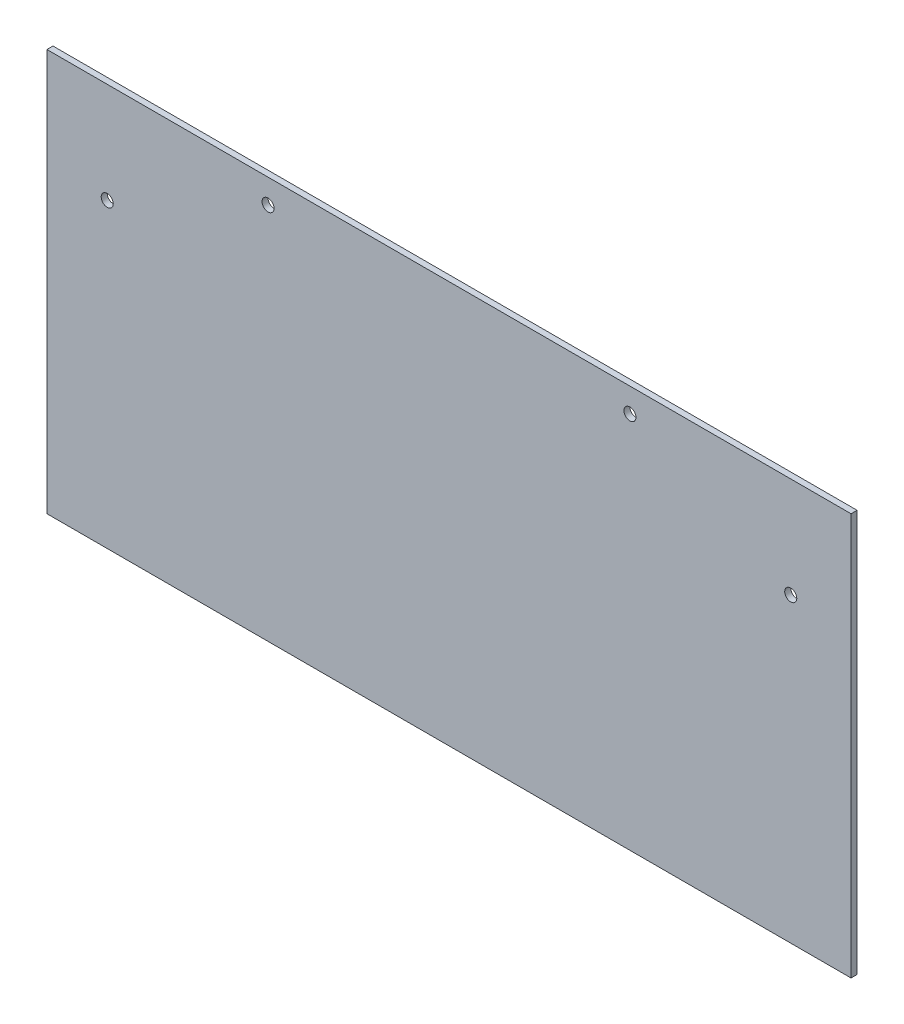
ISO-10303-21;
HEADER;
FILE_DESCRIPTION(('STEP AP214'),'2;1');
FILE_NAME('part.step','',(''),(''),'','','');
FILE_SCHEMA(('AUTOMOTIVE_DESIGN { 1 0 10303 214 1 1 1 1 }'));
ENDSEC;
DATA;
#1=APPLICATION_CONTEXT('core data for automotive mechanical design processes');
#2=APPLICATION_PROTOCOL_DEFINITION('international standard','automotive_design',2000,#1);
#3=PRODUCT_CONTEXT('',#1,'mechanical');
#4=PRODUCT('Part','Part','',(#3));
#5=PRODUCT_RELATED_PRODUCT_CATEGORY('part','',(#4));
#6=PRODUCT_DEFINITION_FORMATION('','',#4);
#7=PRODUCT_DEFINITION_CONTEXT('part definition',#1,'design');
#8=PRODUCT_DEFINITION('design','',#6,#7);
#9=PRODUCT_DEFINITION_SHAPE('','',#8);
#10=(LENGTH_UNIT() NAMED_UNIT(*) SI_UNIT(.MILLI.,.METRE.));
#11=(NAMED_UNIT(*) PLANE_ANGLE_UNIT() SI_UNIT($,.RADIAN.));
#12=(NAMED_UNIT(*) SI_UNIT($,.STERADIAN.) SOLID_ANGLE_UNIT());
#13=UNCERTAINTY_MEASURE_WITH_UNIT(LENGTH_MEASURE(1.E-05),#10,'distance_accuracy_value','');
#14=(GEOMETRIC_REPRESENTATION_CONTEXT(3) GLOBAL_UNCERTAINTY_ASSIGNED_CONTEXT((#13)) GLOBAL_UNIT_ASSIGNED_CONTEXT((#10,
#11,#12)) REPRESENTATION_CONTEXT('',''));
#15=CARTESIAN_POINT('',(0.,0.,0.));
#16=DIRECTION('',(0.,0.,1.));
#17=DIRECTION('',(1.,0.,0.));
#18=AXIS2_PLACEMENT_3D('',#15,#16,#17);
#19=CARTESIAN_POINT('',(0.,0.,0.));
#20=DIRECTION('',(0.,0.,-1.));
#21=DIRECTION('',(-1.,0.,0.));
#22=AXIS2_PLACEMENT_3D('',#19,#20,#21);
#23=PLANE('',#22);
#24=DIRECTION('',(0.,1.,0.));
#25=VECTOR('',#24,1.);
#26=CARTESIAN_POINT('',(0.,0.,0.));
#27=LINE('',#26,#25);
#28=CARTESIAN_POINT('',(0.,0.,0.));
#29=VERTEX_POINT('',#28);
#30=CARTESIAN_POINT('',(0.,100.,0.));
#31=VERTEX_POINT('',#30);
#32=EDGE_CURVE('E99',#29,#31,#27,.T.);
#33=ORIENTED_EDGE('',*,*,#32,.T.);
#34=DIRECTION('',(1.,0.,0.));
#35=VECTOR('',#34,1.);
#36=CARTESIAN_POINT('',(0.,100.,0.));
#37=LINE('',#36,#35);
#38=CARTESIAN_POINT('',(200.,100.,0.));
#39=VERTEX_POINT('',#38);
#40=EDGE_CURVE('E102',#31,#39,#37,.T.);
#41=ORIENTED_EDGE('',*,*,#40,.T.);
#42=DIRECTION('',(0.,1.,0.));
#43=VECTOR('',#42,1.);
#44=CARTESIAN_POINT('',(200.,0.,0.));
#45=LINE('',#44,#43);
#46=CARTESIAN_POINT('',(200.,0.,0.));
#47=VERTEX_POINT('',#46);
#48=EDGE_CURVE('E90',#47,#39,#45,.T.);
#49=ORIENTED_EDGE('',*,*,#48,.F.);
#50=DIRECTION('',(1.,0.,0.));
#51=VECTOR('',#50,1.);
#52=CARTESIAN_POINT('',(0.,0.,0.));
#53=LINE('',#52,#51);
#54=EDGE_CURVE('E66',#29,#47,#53,.T.);
#55=ORIENTED_EDGE('',*,*,#54,.F.);
#56=EDGE_LOOP('',(#33,#41,#49,#55));
#57=FACE_BOUND('',#56,.T.);
#58=CARTESIAN_POINT('',(185.,75.,0.));
#59=DIRECTION('',(0.,0.,1.));
#60=DIRECTION('',(1.,0.,0.));
#61=AXIS2_PLACEMENT_3D('',#58,#59,#60);
#62=CIRCLE('',#61,1.5);
#63=CARTESIAN_POINT('',(186.5,75.,0.));
#64=VERTEX_POINT('',#63);
#65=EDGE_CURVE('E103',#64,#64,#62,.T.);
#66=ORIENTED_EDGE('',*,*,#65,.T.);
#67=EDGE_LOOP('',(#66));
#68=FACE_BOUND('',#67,.T.);
#69=CARTESIAN_POINT('',(15.,75.,0.));
#70=DIRECTION('',(0.,0.,1.));
#71=DIRECTION('',(1.,0.,0.));
#72=AXIS2_PLACEMENT_3D('',#69,#70,#71);
#73=CIRCLE('',#72,1.5);
#74=CARTESIAN_POINT('',(16.5,75.,0.));
#75=VERTEX_POINT('',#74);
#76=EDGE_CURVE('E150',#75,#75,#73,.T.);
#77=ORIENTED_EDGE('',*,*,#76,.T.);
#78=EDGE_LOOP('',(#77));
#79=FACE_BOUND('',#78,.T.);
#80=CARTESIAN_POINT('',(145.,94.,0.));
#81=DIRECTION('',(0.,0.,1.));
#82=DIRECTION('',(1.,0.,0.));
#83=AXIS2_PLACEMENT_3D('',#80,#81,#82);
#84=CIRCLE('',#83,1.5);
#85=CARTESIAN_POINT('',(146.5,94.,0.));
#86=VERTEX_POINT('',#85);
#87=EDGE_CURVE('E157',#86,#86,#84,.T.);
#88=ORIENTED_EDGE('',*,*,#87,.T.);
#89=EDGE_LOOP('',(#88));
#90=FACE_BOUND('',#89,.T.);
#91=CARTESIAN_POINT('',(55.,94.,0.));
#92=DIRECTION('',(0.,0.,1.));
#93=DIRECTION('',(1.,0.,0.));
#94=AXIS2_PLACEMENT_3D('',#91,#92,#93);
#95=CIRCLE('',#94,1.5);
#96=CARTESIAN_POINT('',(56.5,94.,0.));
#97=VERTEX_POINT('',#96);
#98=EDGE_CURVE('E161',#97,#97,#95,.T.);
#99=ORIENTED_EDGE('',*,*,#98,.T.);
#100=EDGE_LOOP('',(#99));
#101=FACE_BOUND('',#100,.T.);
#102=ADVANCED_FACE('F32',(#57,#68,#79,#90,#101),#23,.T.);
#103=CARTESIAN_POINT('',(0.,0.,1.5));
#104=DIRECTION('',(-1.,0.,0.));
#105=DIRECTION('',(0.,0.,1.));
#106=AXIS2_PLACEMENT_3D('',#103,#104,#105);
#107=PLANE('',#106);
#108=ORIENTED_EDGE('',*,*,#32,.F.);
#109=DIRECTION('',(0.,0.,-1.));
#110=VECTOR('',#109,1.);
#111=CARTESIAN_POINT('',(0.,0.,1.5));
#112=LINE('',#111,#110);
#113=CARTESIAN_POINT('',(0.,0.,1.5));
#114=VERTEX_POINT('',#113);
#115=EDGE_CURVE('E11',#114,#29,#112,.T.);
#116=ORIENTED_EDGE('',*,*,#115,.F.);
#117=DIRECTION('',(0.,1.,0.));
#118=VECTOR('',#117,1.);
#119=CARTESIAN_POINT('',(0.,0.,1.5));
#120=LINE('',#119,#118);
#121=CARTESIAN_POINT('',(0.,100.,1.5));
#122=VERTEX_POINT('',#121);
#123=EDGE_CURVE('E93',#114,#122,#120,.T.);
#124=ORIENTED_EDGE('',*,*,#123,.T.);
#125=DIRECTION('',(0.,0.,-1.));
#126=VECTOR('',#125,1.);
#127=CARTESIAN_POINT('',(0.,100.,1.5));
#128=LINE('',#127,#126);
#129=EDGE_CURVE('E36',#122,#31,#128,.T.);
#130=ORIENTED_EDGE('',*,*,#129,.T.);
#131=EDGE_LOOP('',(#108,#116,#124,#130));
#132=FACE_BOUND('',#131,.T.);
#133=ADVANCED_FACE('F34',(#132),#107,.T.);
#134=CARTESIAN_POINT('',(0.,0.,1.5));
#135=DIRECTION('',(0.,1.,0.));
#136=DIRECTION('',(0.,0.,1.));
#137=AXIS2_PLACEMENT_3D('',#134,#135,#136);
#138=PLANE('',#137);
#139=ORIENTED_EDGE('',*,*,#54,.T.);
#140=DIRECTION('',(0.,0.,-1.));
#141=VECTOR('',#140,1.);
#142=CARTESIAN_POINT('',(200.,0.,1.5));
#143=LINE('',#142,#141);
#144=CARTESIAN_POINT('',(200.,0.,1.5));
#145=VERTEX_POINT('',#144);
#146=EDGE_CURVE('E42',#145,#47,#143,.T.);
#147=ORIENTED_EDGE('',*,*,#146,.F.);
#148=DIRECTION('',(1.,0.,0.));
#149=VECTOR('',#148,1.);
#150=CARTESIAN_POINT('',(0.,0.,1.5));
#151=LINE('',#150,#149);
#152=EDGE_CURVE('E83',#114,#145,#151,.T.);
#153=ORIENTED_EDGE('',*,*,#152,.F.);
#154=ORIENTED_EDGE('',*,*,#115,.T.);
#155=EDGE_LOOP('',(#139,#147,#153,#154));
#156=FACE_BOUND('',#155,.T.);
#157=ADVANCED_FACE('F110',(#156),#138,.F.);
#158=CARTESIAN_POINT('',(200.,0.,1.5));
#159=DIRECTION('',(-1.,0.,0.));
#160=DIRECTION('',(0.,0.,1.));
#161=AXIS2_PLACEMENT_3D('',#158,#159,#160);
#162=PLANE('',#161);
#163=ORIENTED_EDGE('',*,*,#48,.T.);
#164=DIRECTION('',(0.,0.,-1.));
#165=VECTOR('',#164,1.);
#166=CARTESIAN_POINT('',(200.,100.,1.5));
#167=LINE('',#166,#165);
#168=CARTESIAN_POINT('',(200.,100.,1.5));
#169=VERTEX_POINT('',#168);
#170=EDGE_CURVE('E87',#169,#39,#167,.T.);
#171=ORIENTED_EDGE('',*,*,#170,.F.);
#172=DIRECTION('',(0.,1.,0.));
#173=VECTOR('',#172,1.);
#174=CARTESIAN_POINT('',(200.,0.,1.5));
#175=LINE('',#174,#173);
#176=EDGE_CURVE('E78',#145,#169,#175,.T.);
#177=ORIENTED_EDGE('',*,*,#176,.F.);
#178=ORIENTED_EDGE('',*,*,#146,.T.);
#179=EDGE_LOOP('',(#163,#171,#177,#178));
#180=FACE_BOUND('',#179,.T.);
#181=ADVANCED_FACE('F88',(#180),#162,.F.);
#182=CARTESIAN_POINT('',(0.,100.,1.5));
#183=DIRECTION('',(0.,1.,0.));
#184=DIRECTION('',(0.,0.,1.));
#185=AXIS2_PLACEMENT_3D('',#182,#183,#184);
#186=PLANE('',#185);
#187=ORIENTED_EDGE('',*,*,#40,.F.);
#188=ORIENTED_EDGE('',*,*,#129,.F.);
#189=DIRECTION('',(1.,0.,0.));
#190=VECTOR('',#189,1.);
#191=CARTESIAN_POINT('',(0.,100.,1.5));
#192=LINE('',#191,#190);
#193=EDGE_CURVE('E82',#122,#169,#192,.T.);
#194=ORIENTED_EDGE('',*,*,#193,.T.);
#195=ORIENTED_EDGE('',*,*,#170,.T.);
#196=EDGE_LOOP('',(#187,#188,#194,#195));
#197=FACE_BOUND('',#196,.T.);
#198=ADVANCED_FACE('F92',(#197),#186,.T.);
#199=CARTESIAN_POINT('',(0.,0.,1.5));
#200=DIRECTION('',(0.,0.,-1.));
#201=DIRECTION('',(-1.,0.,0.));
#202=AXIS2_PLACEMENT_3D('',#199,#200,#201);
#203=PLANE('',#202);
#204=CARTESIAN_POINT('',(55.,94.,1.5));
#205=DIRECTION('',(0.,0.,1.));
#206=DIRECTION('',(1.,0.,0.));
#207=AXIS2_PLACEMENT_3D('',#204,#205,#206);
#208=CIRCLE('',#207,1.49999999999999);
#209=CARTESIAN_POINT('',(56.5,94.,1.5));
#210=VERTEX_POINT('',#209);
#211=EDGE_CURVE('E137',#210,#210,#208,.T.);
#212=ORIENTED_EDGE('',*,*,#211,.F.);
#213=EDGE_LOOP('',(#212));
#214=FACE_BOUND('',#213,.T.);
#215=CARTESIAN_POINT('',(145.,94.,1.5));
#216=DIRECTION('',(0.,0.,1.));
#217=DIRECTION('',(1.,0.,0.));
#218=AXIS2_PLACEMENT_3D('',#215,#216,#217);
#219=CIRCLE('',#218,1.49999999999997);
#220=CARTESIAN_POINT('',(146.5,94.,1.5));
#221=VERTEX_POINT('',#220);
#222=EDGE_CURVE('E141',#221,#221,#219,.T.);
#223=ORIENTED_EDGE('',*,*,#222,.F.);
#224=EDGE_LOOP('',(#223));
#225=FACE_BOUND('',#224,.T.);
#226=CARTESIAN_POINT('',(15.,75.,1.5));
#227=DIRECTION('',(0.,0.,1.));
#228=DIRECTION('',(1.,0.,0.));
#229=AXIS2_PLACEMENT_3D('',#226,#227,#228);
#230=CIRCLE('',#229,1.49999999999999);
#231=CARTESIAN_POINT('',(16.5,75.,1.5));
#232=VERTEX_POINT('',#231);
#233=EDGE_CURVE('E145',#232,#232,#230,.T.);
#234=ORIENTED_EDGE('',*,*,#233,.F.);
#235=EDGE_LOOP('',(#234));
#236=FACE_BOUND('',#235,.T.);
#237=CARTESIAN_POINT('',(185.,75.,1.5));
#238=DIRECTION('',(0.,0.,1.));
#239=DIRECTION('',(1.,0.,0.));
#240=AXIS2_PLACEMENT_3D('',#237,#238,#239);
#241=CIRCLE('',#240,1.5);
#242=CARTESIAN_POINT('',(186.5,75.,1.5));
#243=VERTEX_POINT('',#242);
#244=EDGE_CURVE('E148',#243,#243,#241,.T.);
#245=ORIENTED_EDGE('',*,*,#244,.F.);
#246=EDGE_LOOP('',(#245));
#247=FACE_BOUND('',#246,.T.);
#248=ORIENTED_EDGE('',*,*,#123,.F.);
#249=ORIENTED_EDGE('',*,*,#152,.T.);
#250=ORIENTED_EDGE('',*,*,#176,.T.);
#251=ORIENTED_EDGE('',*,*,#193,.F.);
#252=EDGE_LOOP('',(#248,#249,#250,#251));
#253=FACE_BOUND('',#252,.T.);
#254=ADVANCED_FACE('F81',(#214,#225,#236,#247,#253),#203,.F.);
#255=CARTESIAN_POINT('',(185.,75.,1.5));
#256=DIRECTION('',(0.,0.,1.));
#257=DIRECTION('',(1.,0.,0.));
#258=AXIS2_PLACEMENT_3D('',#255,#256,#257);
#259=CYLINDRICAL_SURFACE('',#258,1.5);
#260=ORIENTED_EDGE('',*,*,#65,.F.);
#261=EDGE_LOOP('',(#260));
#262=FACE_BOUND('',#261,.T.);
#263=ORIENTED_EDGE('',*,*,#244,.T.);
#264=EDGE_LOOP('',(#263));
#265=FACE_BOUND('',#264,.T.);
#266=ADVANCED_FACE('F127',(#262,#265),#259,.F.);
#267=CARTESIAN_POINT('',(15.,75.,1.5));
#268=DIRECTION('',(0.,0.,1.));
#269=DIRECTION('',(1.,0.,0.));
#270=AXIS2_PLACEMENT_3D('',#267,#268,#269);
#271=CYLINDRICAL_SURFACE('',#270,1.49999999999999);
#272=ORIENTED_EDGE('',*,*,#76,.F.);
#273=EDGE_LOOP('',(#272));
#274=FACE_BOUND('',#273,.T.);
#275=ORIENTED_EDGE('',*,*,#233,.T.);
#276=EDGE_LOOP('',(#275));
#277=FACE_BOUND('',#276,.T.);
#278=ADVANCED_FACE('F132',(#274,#277),#271,.F.);
#279=CARTESIAN_POINT('',(145.,94.,1.5));
#280=DIRECTION('',(0.,0.,1.));
#281=DIRECTION('',(1.,0.,0.));
#282=AXIS2_PLACEMENT_3D('',#279,#280,#281);
#283=CYLINDRICAL_SURFACE('',#282,1.49999999999999);
#284=ORIENTED_EDGE('',*,*,#87,.F.);
#285=EDGE_LOOP('',(#284));
#286=FACE_BOUND('',#285,.T.);
#287=ORIENTED_EDGE('',*,*,#222,.T.);
#288=EDGE_LOOP('',(#287));
#289=FACE_BOUND('',#288,.T.);
#290=ADVANCED_FACE('F167',(#286,#289),#283,.F.);
#291=CARTESIAN_POINT('',(55.,94.,1.5));
#292=DIRECTION('',(0.,0.,1.));
#293=DIRECTION('',(1.,0.,0.));
#294=AXIS2_PLACEMENT_3D('',#291,#292,#293);
#295=CYLINDRICAL_SURFACE('',#294,1.49999999999999);
#296=ORIENTED_EDGE('',*,*,#98,.F.);
#297=EDGE_LOOP('',(#296));
#298=FACE_BOUND('',#297,.T.);
#299=ORIENTED_EDGE('',*,*,#211,.T.);
#300=EDGE_LOOP('',(#299));
#301=FACE_BOUND('',#300,.T.);
#302=ADVANCED_FACE('F165',(#298,#301),#295,.F.);
#303=CLOSED_SHELL('',(#102,#133,#157,#181,#198,#254,#266,#278,#290,#302));
#304=MANIFOLD_SOLID_BREP('B2',#303);
#305=ADVANCED_BREP_SHAPE_REPRESENTATION('',(#18,#304),#14);
#306=SHAPE_DEFINITION_REPRESENTATION(#9,#305);
ENDSEC;
END-ISO-10303-21;
